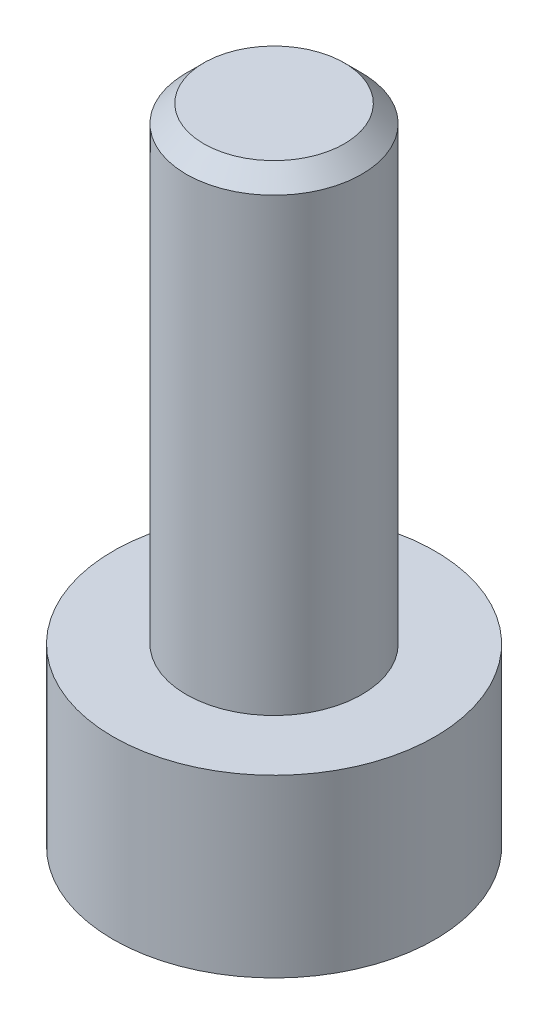
ISO-10303-21;
HEADER;
FILE_DESCRIPTION(('STEP AP214'),'2;1');
FILE_NAME('part.step','',(''),(''),'','','');
FILE_SCHEMA(('AUTOMOTIVE_DESIGN { 1 0 10303 214 1 1 1 1 }'));
ENDSEC;
DATA;
#1=APPLICATION_CONTEXT('core data for automotive mechanical design processes');
#2=APPLICATION_PROTOCOL_DEFINITION('international standard','automotive_design',2000,#1);
#3=PRODUCT_CONTEXT('',#1,'mechanical');
#4=PRODUCT('Part','Part','',(#3));
#5=PRODUCT_RELATED_PRODUCT_CATEGORY('part','',(#4));
#6=PRODUCT_DEFINITION_FORMATION('','',#4);
#7=PRODUCT_DEFINITION_CONTEXT('part definition',#1,'design');
#8=PRODUCT_DEFINITION('design','',#6,#7);
#9=PRODUCT_DEFINITION_SHAPE('','',#8);
#10=(LENGTH_UNIT() NAMED_UNIT(*) SI_UNIT(.MILLI.,.METRE.));
#11=(NAMED_UNIT(*) PLANE_ANGLE_UNIT() SI_UNIT($,.RADIAN.));
#12=(NAMED_UNIT(*) SI_UNIT($,.STERADIAN.) SOLID_ANGLE_UNIT());
#13=UNCERTAINTY_MEASURE_WITH_UNIT(LENGTH_MEASURE(1.E-05),#10,'distance_accuracy_value','');
#14=(GEOMETRIC_REPRESENTATION_CONTEXT(3) GLOBAL_UNCERTAINTY_ASSIGNED_CONTEXT((#13)) GLOBAL_UNIT_ASSIGNED_CONTEXT((#10,
#11,#12)) REPRESENTATION_CONTEXT('',''));
#15=CARTESIAN_POINT('',(0.,0.,0.));
#16=DIRECTION('',(0.,0.,1.));
#17=DIRECTION('',(1.,0.,0.));
#18=AXIS2_PLACEMENT_3D('',#15,#16,#17);
#19=CARTESIAN_POINT('',(0.,1.92979773958908,0.));
#20=DIRECTION('',(0.,1.,0.));
#21=DIRECTION('',(0.,0.,1.));
#22=AXIS2_PLACEMENT_3D('',#19,#20,#21);
#23=PLANE('',#22);
#24=CARTESIAN_POINT('',(0.,1.92979773958908,0.));
#25=DIRECTION('',(0.,1.,0.));
#26=DIRECTION('',(0.,0.,1.));
#27=AXIS2_PLACEMENT_3D('',#24,#25,#26);
#28=CIRCLE('',#27,5.5);
#29=CARTESIAN_POINT('',(0.,1.92979773958908,5.5));
#30=VERTEX_POINT('',#29);
#31=EDGE_CURVE('E146',#30,#30,#28,.T.);
#32=ORIENTED_EDGE('',*,*,#31,.T.);
#33=EDGE_LOOP('',(#32));
#34=FACE_BOUND('',#33,.T.);
#35=CARTESIAN_POINT('',(0.,1.92979773958908,0.));
#36=DIRECTION('',(0.,1.,0.));
#37=DIRECTION('',(0.,0.,1.));
#38=AXIS2_PLACEMENT_3D('',#35,#36,#37);
#39=CIRCLE('',#38,3.);
#40=CARTESIAN_POINT('',(0.,1.92979773958908,3.));
#41=VERTEX_POINT('',#40);
#42=EDGE_CURVE('E127',#41,#41,#39,.T.);
#43=ORIENTED_EDGE('',*,*,#42,.F.);
#44=EDGE_LOOP('',(#43));
#45=FACE_BOUND('',#44,.T.);
#46=ADVANCED_FACE('F37',(#34,#45),#23,.T.);
#47=CARTESIAN_POINT('',(0.,1.92979773958908,0.));
#48=DIRECTION('',(0.,-1.,0.));
#49=DIRECTION('',(0.,0.,-1.));
#50=AXIS2_PLACEMENT_3D('',#47,#48,#49);
#51=CYLINDRICAL_SURFACE('',#50,5.5);
#52=ORIENTED_EDGE('',*,*,#31,.F.);
#53=EDGE_LOOP('',(#52));
#54=FACE_BOUND('',#53,.T.);
#55=CARTESIAN_POINT('',(0.,-4.07020226041092,0.));
#56=DIRECTION('',(0.,1.,0.));
#57=DIRECTION('',(0.,0.,1.));
#58=AXIS2_PLACEMENT_3D('',#55,#56,#57);
#59=CIRCLE('',#58,5.5);
#60=CARTESIAN_POINT('',(0.,-4.07020226041092,5.5));
#61=VERTEX_POINT('',#60);
#62=EDGE_CURVE('E140',#61,#61,#59,.T.);
#63=ORIENTED_EDGE('',*,*,#62,.T.);
#64=EDGE_LOOP('',(#63));
#65=FACE_BOUND('',#64,.T.);
#66=ADVANCED_FACE('F164',(#54,#65),#51,.T.);
#67=CARTESIAN_POINT('',(0.,-4.07020226041092,0.));
#68=DIRECTION('',(0.,1.,0.));
#69=DIRECTION('',(0.,0.,1.));
#70=AXIS2_PLACEMENT_3D('',#67,#68,#69);
#71=PLANE('',#70);
#72=DIRECTION('',(-0.866025403784438,0.,-0.5));
#73=VECTOR('',#72,1.);
#74=CARTESIAN_POINT('',(0.,-4.07020226041092,2.5));
#75=LINE('',#74,#73);
#76=CARTESIAN_POINT('',(0.,-4.07020226041092,2.5));
#77=VERTEX_POINT('',#76);
#78=CARTESIAN_POINT('',(-2.1650635094611,-4.07020226041092,1.25));
#79=VERTEX_POINT('',#78);
#80=EDGE_CURVE('E126',#77,#79,#75,.T.);
#81=ORIENTED_EDGE('',*,*,#80,.F.);
#82=DIRECTION('',(-0.866025403784439,0.,0.5));
#83=VECTOR('',#82,1.);
#84=CARTESIAN_POINT('',(2.1650635094611,-4.07020226041092,1.25));
#85=LINE('',#84,#83);
#86=CARTESIAN_POINT('',(2.1650635094611,-4.07020226041092,1.25));
#87=VERTEX_POINT('',#86);
#88=EDGE_CURVE('E52',#87,#77,#85,.T.);
#89=ORIENTED_EDGE('',*,*,#88,.F.);
#90=DIRECTION('',(0.,0.,1.));
#91=VECTOR('',#90,1.);
#92=CARTESIAN_POINT('',(2.1650635094611,-4.07020226041092,-1.25));
#93=LINE('',#92,#91);
#94=CARTESIAN_POINT('',(2.1650635094611,-4.07020226041092,-1.25));
#95=VERTEX_POINT('',#94);
#96=EDGE_CURVE('E136',#95,#87,#93,.T.);
#97=ORIENTED_EDGE('',*,*,#96,.F.);
#98=DIRECTION('',(0.866025403784439,0.,0.5));
#99=VECTOR('',#98,1.);
#100=CARTESIAN_POINT('',(0.,-4.07020226041092,-2.5));
#101=LINE('',#100,#99);
#102=CARTESIAN_POINT('',(0.,-4.07020226041092,-2.5));
#103=VERTEX_POINT('',#102);
#104=EDGE_CURVE('E134',#103,#95,#101,.T.);
#105=ORIENTED_EDGE('',*,*,#104,.F.);
#106=DIRECTION('',(0.866025403784439,0.,-0.5));
#107=VECTOR('',#106,1.);
#108=CARTESIAN_POINT('',(-2.1650635094611,-4.07020226041092,-1.25));
#109=LINE('',#108,#107);
#110=CARTESIAN_POINT('',(-2.1650635094611,-4.07020226041092,-1.25));
#111=VERTEX_POINT('',#110);
#112=EDGE_CURVE('E100',#111,#103,#109,.T.);
#113=ORIENTED_EDGE('',*,*,#112,.F.);
#114=DIRECTION('',(0.,0.,-1.));
#115=VECTOR('',#114,1.);
#116=CARTESIAN_POINT('',(-2.1650635094611,-4.07020226041092,1.25));
#117=LINE('',#116,#115);
#118=EDGE_CURVE('E130',#79,#111,#117,.T.);
#119=ORIENTED_EDGE('',*,*,#118,.F.);
#120=EDGE_LOOP('',(#81,#89,#97,#105,#113,#119));
#121=FACE_BOUND('',#120,.T.);
#122=ORIENTED_EDGE('',*,*,#62,.F.);
#123=EDGE_LOOP('',(#122));
#124=FACE_BOUND('',#123,.T.);
#125=ADVANCED_FACE('F170',(#121,#124),#71,.F.);
#126=CARTESIAN_POINT('',(2.1650635094611,-1.07020226041092,1.25));
#127=DIRECTION('',(0.5,0.,0.866025403784439));
#128=DIRECTION('',(0.866025403784439,0.,-0.5));
#129=AXIS2_PLACEMENT_3D('',#126,#127,#128);
#130=PLANE('',#129);
#131=ORIENTED_EDGE('',*,*,#88,.T.);
#132=DIRECTION('',(0.,-1.,0.));
#133=VECTOR('',#132,1.);
#134=CARTESIAN_POINT('',(0.,-1.07020226041092,2.5));
#135=LINE('',#134,#133);
#136=CARTESIAN_POINT('',(0.,-1.07020226041092,2.5));
#137=VERTEX_POINT('',#136);
#138=EDGE_CURVE('E82',#137,#77,#135,.T.);
#139=ORIENTED_EDGE('',*,*,#138,.F.);
#140=DIRECTION('',(-0.866025403784439,0.,0.5));
#141=VECTOR('',#140,1.);
#142=CARTESIAN_POINT('',(2.1650635094611,-1.07020226041092,1.25));
#143=LINE('',#142,#141);
#144=CARTESIAN_POINT('',(2.1650635094611,-1.07020226041092,1.25));
#145=VERTEX_POINT('',#144);
#146=EDGE_CURVE('E138',#145,#137,#143,.T.);
#147=ORIENTED_EDGE('',*,*,#146,.F.);
#148=DIRECTION('',(0.,-1.,0.));
#149=VECTOR('',#148,1.);
#150=CARTESIAN_POINT('',(2.1650635094611,-1.07020226041092,1.25));
#151=LINE('',#150,#149);
#152=EDGE_CURVE('E60',#145,#87,#151,.T.);
#153=ORIENTED_EDGE('',*,*,#152,.T.);
#154=EDGE_LOOP('',(#131,#139,#147,#153));
#155=FACE_BOUND('',#154,.T.);
#156=ADVANCED_FACE('F175',(#155),#130,.F.);
#157=CARTESIAN_POINT('',(2.1650635094611,-1.07020226041092,-1.25));
#158=DIRECTION('',(1.,0.,0.));
#159=DIRECTION('',(0.,0.,-1.));
#160=AXIS2_PLACEMENT_3D('',#157,#158,#159);
#161=PLANE('',#160);
#162=ORIENTED_EDGE('',*,*,#96,.T.);
#163=ORIENTED_EDGE('',*,*,#152,.F.);
#164=DIRECTION('',(0.,0.,1.));
#165=VECTOR('',#164,1.);
#166=CARTESIAN_POINT('',(2.1650635094611,-1.07020226041092,-1.25));
#167=LINE('',#166,#165);
#168=CARTESIAN_POINT('',(2.1650635094611,-1.07020226041092,-1.25));
#169=VERTEX_POINT('',#168);
#170=EDGE_CURVE('E112',#169,#145,#167,.T.);
#171=ORIENTED_EDGE('',*,*,#170,.F.);
#172=DIRECTION('',(0.,-1.,0.));
#173=VECTOR('',#172,1.);
#174=CARTESIAN_POINT('',(2.1650635094611,-1.07020226041092,-1.25));
#175=LINE('',#174,#173);
#176=EDGE_CURVE('E104',#169,#95,#175,.T.);
#177=ORIENTED_EDGE('',*,*,#176,.T.);
#178=EDGE_LOOP('',(#162,#163,#171,#177));
#179=FACE_BOUND('',#178,.T.);
#180=ADVANCED_FACE('F182',(#179),#161,.F.);
#181=CARTESIAN_POINT('',(0.,-1.07020226041092,-2.5));
#182=DIRECTION('',(0.5,0.,-0.866025403784438));
#183=DIRECTION('',(-0.866025403784439,0.,-0.5));
#184=AXIS2_PLACEMENT_3D('',#181,#182,#183);
#185=PLANE('',#184);
#186=ORIENTED_EDGE('',*,*,#104,.T.);
#187=ORIENTED_EDGE('',*,*,#176,.F.);
#188=DIRECTION('',(0.866025403784439,0.,0.5));
#189=VECTOR('',#188,1.);
#190=CARTESIAN_POINT('',(0.,-1.07020226041092,-2.5));
#191=LINE('',#190,#189);
#192=CARTESIAN_POINT('',(0.,-1.07020226041092,-2.5));
#193=VERTEX_POINT('',#192);
#194=EDGE_CURVE('E108',#193,#169,#191,.T.);
#195=ORIENTED_EDGE('',*,*,#194,.F.);
#196=DIRECTION('',(0.,-1.,0.));
#197=VECTOR('',#196,1.);
#198=CARTESIAN_POINT('',(0.,-1.07020226041092,-2.5));
#199=LINE('',#198,#197);
#200=EDGE_CURVE('E93',#193,#103,#199,.T.);
#201=ORIENTED_EDGE('',*,*,#200,.T.);
#202=EDGE_LOOP('',(#186,#187,#195,#201));
#203=FACE_BOUND('',#202,.T.);
#204=ADVANCED_FACE('F109',(#203),#185,.F.);
#205=CARTESIAN_POINT('',(-2.1650635094611,-1.07020226041092,-1.25));
#206=DIRECTION('',(-0.5,0.,-0.866025403784438));
#207=DIRECTION('',(-0.866025403784439,0.,0.5));
#208=AXIS2_PLACEMENT_3D('',#205,#206,#207);
#209=PLANE('',#208);
#210=ORIENTED_EDGE('',*,*,#112,.T.);
#211=ORIENTED_EDGE('',*,*,#200,.F.);
#212=DIRECTION('',(0.866025403784439,0.,-0.5));
#213=VECTOR('',#212,1.);
#214=CARTESIAN_POINT('',(-2.1650635094611,-1.07020226041092,-1.25));
#215=LINE('',#214,#213);
#216=CARTESIAN_POINT('',(-2.1650635094611,-1.07020226041092,-1.25));
#217=VERTEX_POINT('',#216);
#218=EDGE_CURVE('E97',#217,#193,#215,.T.);
#219=ORIENTED_EDGE('',*,*,#218,.F.);
#220=DIRECTION('',(0.,-1.,0.));
#221=VECTOR('',#220,1.);
#222=CARTESIAN_POINT('',(-2.1650635094611,-1.07020226041092,-1.25));
#223=LINE('',#222,#221);
#224=EDGE_CURVE('E105',#217,#111,#223,.T.);
#225=ORIENTED_EDGE('',*,*,#224,.T.);
#226=EDGE_LOOP('',(#210,#211,#219,#225));
#227=FACE_BOUND('',#226,.T.);
#228=ADVANCED_FACE('F95',(#227),#209,.F.);
#229=CARTESIAN_POINT('',(-2.1650635094611,-1.07020226041092,1.25));
#230=DIRECTION('',(-1.,0.,0.));
#231=DIRECTION('',(0.,0.,1.));
#232=AXIS2_PLACEMENT_3D('',#229,#230,#231);
#233=PLANE('',#232);
#234=ORIENTED_EDGE('',*,*,#118,.T.);
#235=ORIENTED_EDGE('',*,*,#224,.F.);
#236=DIRECTION('',(0.,0.,-1.));
#237=VECTOR('',#236,1.);
#238=CARTESIAN_POINT('',(-2.1650635094611,-1.07020226041092,1.25));
#239=LINE('',#238,#237);
#240=CARTESIAN_POINT('',(-2.1650635094611,-1.07020226041092,1.25));
#241=VERTEX_POINT('',#240);
#242=EDGE_CURVE('E118',#241,#217,#239,.T.);
#243=ORIENTED_EDGE('',*,*,#242,.F.);
#244=DIRECTION('',(0.,-1.,0.));
#245=VECTOR('',#244,1.);
#246=CARTESIAN_POINT('',(-2.1650635094611,-1.07020226041092,1.25));
#247=LINE('',#246,#245);
#248=EDGE_CURVE('E143',#241,#79,#247,.T.);
#249=ORIENTED_EDGE('',*,*,#248,.T.);
#250=EDGE_LOOP('',(#234,#235,#243,#249));
#251=FACE_BOUND('',#250,.T.);
#252=ADVANCED_FACE('F210',(#251),#233,.F.);
#253=CARTESIAN_POINT('',(0.,-1.07020226041092,2.5));
#254=DIRECTION('',(-0.5,0.,0.866025403784439));
#255=DIRECTION('',(0.866025403784439,0.,0.5));
#256=AXIS2_PLACEMENT_3D('',#253,#254,#255);
#257=PLANE('',#256);
#258=ORIENTED_EDGE('',*,*,#80,.T.);
#259=ORIENTED_EDGE('',*,*,#248,.F.);
#260=DIRECTION('',(-0.866025403784438,0.,-0.5));
#261=VECTOR('',#260,1.);
#262=CARTESIAN_POINT('',(0.,-1.07020226041092,2.5));
#263=LINE('',#262,#261);
#264=EDGE_CURVE('E120',#137,#241,#263,.T.);
#265=ORIENTED_EDGE('',*,*,#264,.F.);
#266=ORIENTED_EDGE('',*,*,#138,.T.);
#267=EDGE_LOOP('',(#258,#259,#265,#266));
#268=FACE_BOUND('',#267,.T.);
#269=ADVANCED_FACE('F190',(#268),#257,.F.);
#270=CARTESIAN_POINT('',(0.,-1.07020226041092,0.));
#271=DIRECTION('',(0.,-1.,0.));
#272=DIRECTION('',(0.,0.,-1.));
#273=AXIS2_PLACEMENT_3D('',#270,#271,#272);
#274=PLANE('',#273);
#275=ORIENTED_EDGE('',*,*,#146,.T.);
#276=ORIENTED_EDGE('',*,*,#264,.T.);
#277=ORIENTED_EDGE('',*,*,#242,.T.);
#278=ORIENTED_EDGE('',*,*,#218,.T.);
#279=ORIENTED_EDGE('',*,*,#194,.T.);
#280=ORIENTED_EDGE('',*,*,#170,.T.);
#281=EDGE_LOOP('',(#275,#276,#277,#278,#279,#280));
#282=FACE_BOUND('',#281,.T.);
#283=ADVANCED_FACE('F115',(#282),#274,.T.);
#284=CARTESIAN_POINT('',(0.,17.9297977395891,0.));
#285=DIRECTION('',(0.,-1.,0.));
#286=DIRECTION('',(0.,0.,-1.));
#287=AXIS2_PLACEMENT_3D('',#284,#285,#286);
#288=CYLINDRICAL_SURFACE('',#287,3.);
#289=CARTESIAN_POINT('',(0.,17.3297977395891,0.));
#290=DIRECTION('',(0.,1.,0.));
#291=DIRECTION('',(0.,0.,1.));
#292=AXIS2_PLACEMENT_3D('',#289,#290,#291);
#293=CIRCLE('',#292,3.);
#294=CARTESIAN_POINT('',(0.,17.3297977395891,3.));
#295=VERTEX_POINT('',#294);
#296=EDGE_CURVE('E11',#295,#295,#293,.F.);
#297=ORIENTED_EDGE('',*,*,#296,.T.);
#298=EDGE_LOOP('',(#297));
#299=FACE_BOUND('',#298,.T.);
#300=ORIENTED_EDGE('',*,*,#42,.T.);
#301=EDGE_LOOP('',(#300));
#302=FACE_BOUND('',#301,.T.);
#303=ADVANCED_FACE('F160',(#299,#302),#288,.T.);
#304=CARTESIAN_POINT('',(0.,17.9297977395891,0.));
#305=DIRECTION('',(0.,1.,0.));
#306=DIRECTION('',(0.,0.,1.));
#307=AXIS2_PLACEMENT_3D('',#304,#305,#306);
#308=PLANE('',#307);
#309=CARTESIAN_POINT('',(0.,17.9297977395891,0.));
#310=DIRECTION('',(0.,1.,0.));
#311=DIRECTION('',(0.,0.,1.));
#312=AXIS2_PLACEMENT_3D('',#309,#310,#311);
#313=CIRCLE('',#312,2.40000000000001);
#314=CARTESIAN_POINT('',(0.,17.9297977395891,2.40000000000001));
#315=VERTEX_POINT('',#314);
#316=EDGE_CURVE('E45',#315,#315,#313,.T.);
#317=ORIENTED_EDGE('',*,*,#316,.T.);
#318=EDGE_LOOP('',(#317));
#319=FACE_BOUND('',#318,.T.);
#320=ADVANCED_FACE('F153',(#319),#308,.T.);
#321=CARTESIAN_POINT('',(0.,17.9297977395891,0.));
#322=DIRECTION('',(0.,-1.,0.));
#323=DIRECTION('',(0.,0.,-1.));
#324=AXIS2_PLACEMENT_3D('',#321,#322,#323);
#325=CONICAL_SURFACE('',#324,2.40000000000001,0.785398163397444);
#326=ORIENTED_EDGE('',*,*,#296,.F.);
#327=EDGE_LOOP('',(#326));
#328=FACE_BOUND('',#327,.T.);
#329=ORIENTED_EDGE('',*,*,#316,.F.);
#330=EDGE_LOOP('',(#329));
#331=FACE_BOUND('',#330,.T.);
#332=ADVANCED_FACE('F39',(#328,#331),#325,.T.);
#333=CLOSED_SHELL('',(#46,#66,#125,#156,#180,#204,#228,#252,#269,#283,#303,#320,#332));
#334=MANIFOLD_SOLID_BREP('B2',#333);
#335=ADVANCED_BREP_SHAPE_REPRESENTATION('',(#18,#334),#14);
#336=SHAPE_DEFINITION_REPRESENTATION(#9,#335);
ENDSEC;
END-ISO-10303-21;
